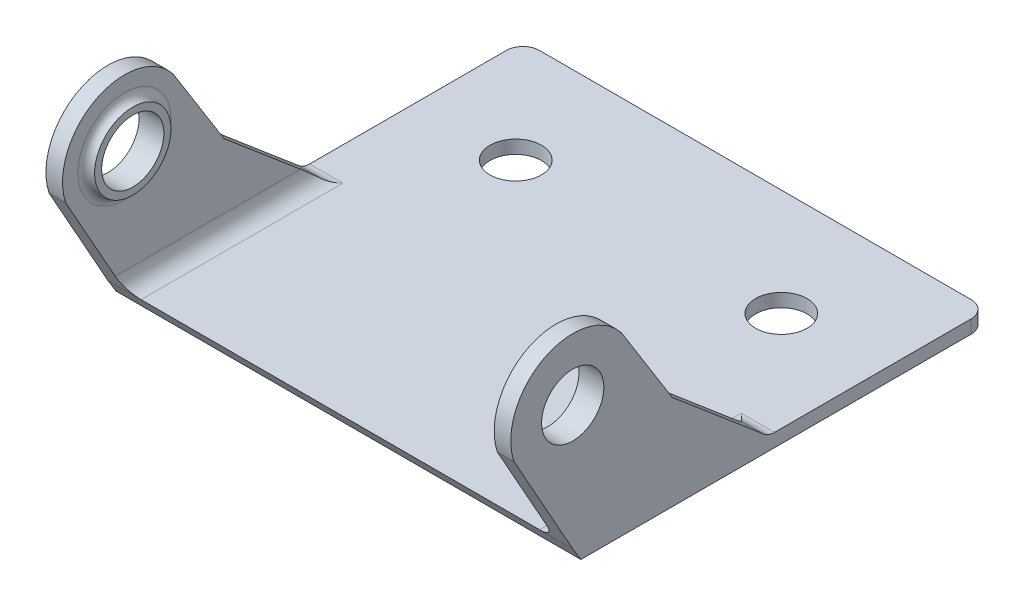
ISO-10303-21;
HEADER;
FILE_DESCRIPTION(('STEP AP214'),'2;1');
FILE_NAME('part.step','',(''),(''),'','','');
FILE_SCHEMA(('AUTOMOTIVE_DESIGN { 1 0 10303 214 1 1 1 1 }'));
ENDSEC;
DATA;
#1=APPLICATION_CONTEXT('core data for automotive mechanical design processes');
#2=APPLICATION_PROTOCOL_DEFINITION('international standard','automotive_design',2000,#1);
#3=PRODUCT_CONTEXT('',#1,'mechanical');
#4=PRODUCT('Part','Part','',(#3));
#5=PRODUCT_RELATED_PRODUCT_CATEGORY('part','',(#4));
#6=PRODUCT_DEFINITION_FORMATION('','',#4);
#7=PRODUCT_DEFINITION_CONTEXT('part definition',#1,'design');
#8=PRODUCT_DEFINITION('design','',#6,#7);
#9=PRODUCT_DEFINITION_SHAPE('','',#8);
#10=(LENGTH_UNIT() NAMED_UNIT(*) SI_UNIT(.MILLI.,.METRE.));
#11=(NAMED_UNIT(*) PLANE_ANGLE_UNIT() SI_UNIT($,.RADIAN.));
#12=(NAMED_UNIT(*) SI_UNIT($,.STERADIAN.) SOLID_ANGLE_UNIT());
#13=UNCERTAINTY_MEASURE_WITH_UNIT(LENGTH_MEASURE(1.E-05),#10,'distance_accuracy_value','');
#14=(GEOMETRIC_REPRESENTATION_CONTEXT(3) GLOBAL_UNCERTAINTY_ASSIGNED_CONTEXT((#13)) GLOBAL_UNIT_ASSIGNED_CONTEXT((#10,
#11,#12)) REPRESENTATION_CONTEXT('',''));
#15=CARTESIAN_POINT('',(0.,0.,0.));
#16=DIRECTION('',(0.,0.,1.));
#17=DIRECTION('',(1.,0.,0.));
#18=AXIS2_PLACEMENT_3D('',#15,#16,#17);
#19=CARTESIAN_POINT('',(31.7500000000001,21.082,47.155100000013));
#20=DIRECTION('',(1.,0.,0.));
#21=DIRECTION('',(0.,0.,-1.));
#22=AXIS2_PLACEMENT_3D('',#19,#20,#21);
#23=TOROIDAL_SURFACE('',#22,7.112,1.27);
#24=CARTESIAN_POINT('',(33.0200000000001,21.082,47.155100000013));
#25=DIRECTION('',(1.,0.,0.));
#26=DIRECTION('',(0.,0.,-1.));
#27=AXIS2_PLACEMENT_3D('',#24,#25,#26);
#28=CIRCLE('',#27,7.112);
#29=CARTESIAN_POINT('',(33.0200000000001,21.082,40.043100000013));
#30=VERTEX_POINT('',#29);
#31=EDGE_CURVE('E11',#30,#30,#28,.T.);
#32=ORIENTED_EDGE('',*,*,#31,.F.);
#33=EDGE_LOOP('',(#32));
#34=FACE_BOUND('',#33,.T.);
#35=CARTESIAN_POINT('',(31.7500000000001,21.082,47.155100000013));
#36=DIRECTION('',(-1.,0.,0.));
#37=DIRECTION('',(0.,0.,1.));
#38=AXIS2_PLACEMENT_3D('',#35,#36,#37);
#39=CIRCLE('',#38,5.842);
#40=CARTESIAN_POINT('',(31.7500000000001,21.082,52.997100000013));
#41=VERTEX_POINT('',#40);
#42=EDGE_CURVE('E303',#41,#41,#39,.T.);
#43=ORIENTED_EDGE('',*,*,#42,.F.);
#44=EDGE_LOOP('',(#43));
#45=FACE_BOUND('',#44,.T.);
#46=ADVANCED_FACE('F47',(#34,#45),#23,.F.);
#47=CARTESIAN_POINT('',(33.0200000000001,0.,0.));
#48=DIRECTION('',(1.,0.,0.));
#49=DIRECTION('',(0.,0.,-1.));
#50=AXIS2_PLACEMENT_3D('',#47,#48,#49);
#51=PLANE('',#50);
#52=ORIENTED_EDGE('',*,*,#31,.T.);
#53=EDGE_LOOP('',(#52));
#54=FACE_BOUND('',#53,.T.);
#55=DIRECTION('',(0.,0.646256714414284,0.763120081687315));
#56=VECTOR('',#55,1.);
#57=CARTESIAN_POINT('',(33.0200000000001,-7.30742805350041,6.18837658449795));
#58=LINE('',#57,#56);
#59=CARTESIAN_POINT('',(33.0200000000001,4.572,20.2159756861986));
#60=VERTEX_POINT('',#59);
#61=CARTESIAN_POINT('',(33.0200000000001,14.4926375068564,31.9305738261713));
#62=VERTEX_POINT('',#61);
#63=EDGE_CURVE('E221',#60,#62,#58,.T.);
#64=ORIENTED_EDGE('',*,*,#63,.F.);
#65=DIRECTION('',(0.,0.,1.));
#66=VECTOR('',#65,1.);
#67=CARTESIAN_POINT('',(33.0200000000001,4.572,0.));
#68=LINE('',#67,#66);
#69=CARTESIAN_POINT('',(33.0200000000001,4.572,48.5771478370212));
#70=VERTEX_POINT('',#69);
#71=EDGE_CURVE('E243',#60,#70,#68,.T.);
#72=ORIENTED_EDGE('',*,*,#71,.T.);
#73=DIRECTION('',(0.,0.872557584871578,0.488511270169972));
#74=VECTOR('',#73,1.);
#75=CARTESIAN_POINT('',(33.0200000000001,-19.6151369839456,35.0357045962964));
#76=LINE('',#75,#74);
#77=CARTESIAN_POINT('',(33.0200000000001,18.1012641162531,56.1516599523088));
#78=VERTEX_POINT('',#77);
#79=EDGE_CURVE('E360',#70,#78,#76,.T.);
#80=ORIENTED_EDGE('',*,*,#79,.T.);
#81=CARTESIAN_POINT('',(33.0200000000001,21.082,47.155100000013));
#82=DIRECTION('',(1.,0.,0.));
#83=DIRECTION('',(0.,0.,-1.));
#84=AXIS2_PLACEMENT_3D('',#81,#82,#83);
#85=CIRCLE('',#84,9.47749320146993);
#86=CARTESIAN_POINT('',(33.0200000000001,26.9532750137127,39.71527425627));
#87=VERTEX_POINT('',#86);
#88=EDGE_CURVE('E357',#87,#78,#85,.T.);
#89=ORIENTED_EDGE('',*,*,#88,.F.);
#90=DIRECTION('',(0.,0.848096115683088,0.529842409177728));
#91=VECTOR('',#90,1.);
#92=CARTESIAN_POINT('',(33.0200000000001,-10.2796748009247,16.4542364260335));
#93=LINE('',#92,#91);
#94=EDGE_CURVE('E354',#62,#87,#93,.T.);
#95=ORIENTED_EDGE('',*,*,#94,.F.);
#96=EDGE_LOOP('',(#64,#72,#80,#89,#95));
#97=FACE_BOUND('',#96,.T.);
#98=ADVANCED_FACE('F450',(#54,#97),#51,.F.);
#99=CARTESIAN_POINT('',(-31.7499999999999,21.082,47.155100000013));
#100=DIRECTION('',(1.,0.,0.));
#101=DIRECTION('',(0.,0.,-1.));
#102=AXIS2_PLACEMENT_3D('',#99,#100,#101);
#103=TOROIDAL_SURFACE('',#102,7.112,1.27);
#104=CARTESIAN_POINT('',(-33.0199999999999,21.082,47.155100000013));
#105=DIRECTION('',(1.,0.,0.));
#106=DIRECTION('',(0.,0.,-1.));
#107=AXIS2_PLACEMENT_3D('',#104,#105,#106);
#108=CIRCLE('',#107,7.112);
#109=CARTESIAN_POINT('',(-33.0199999999999,21.082,40.043100000013));
#110=VERTEX_POINT('',#109);
#111=EDGE_CURVE('E55',#110,#110,#108,.F.);
#112=ORIENTED_EDGE('',*,*,#111,.F.);
#113=EDGE_LOOP('',(#112));
#114=FACE_BOUND('',#113,.T.);
#115=CARTESIAN_POINT('',(-31.7499999999999,21.082,47.155100000013));
#116=DIRECTION('',(1.,0.,0.));
#117=DIRECTION('',(0.,0.,-1.));
#118=AXIS2_PLACEMENT_3D('',#115,#116,#117);
#119=CIRCLE('',#118,5.842);
#120=CARTESIAN_POINT('',(-31.7499999999999,21.082,41.313100000013));
#121=VERTEX_POINT('',#120);
#122=EDGE_CURVE('E268',#121,#121,#119,.T.);
#123=ORIENTED_EDGE('',*,*,#122,.F.);
#124=EDGE_LOOP('',(#123));
#125=FACE_BOUND('',#124,.T.);
#126=ADVANCED_FACE('F456',(#114,#125),#103,.F.);
#127=CARTESIAN_POINT('',(-33.0199999999999,0.,0.));
#128=DIRECTION('',(1.,0.,0.));
#129=DIRECTION('',(0.,0.,-1.));
#130=AXIS2_PLACEMENT_3D('',#127,#128,#129);
#131=PLANE('',#130);
#132=ORIENTED_EDGE('',*,*,#111,.T.);
#133=EDGE_LOOP('',(#132));
#134=FACE_BOUND('',#133,.T.);
#135=DIRECTION('',(0.,0.872557584871578,0.488511270169972));
#136=VECTOR('',#135,1.);
#137=CARTESIAN_POINT('',(-33.0199999999999,-19.6151369839456,35.0357045962964));
#138=LINE('',#137,#136);
#139=CARTESIAN_POINT('',(-33.0199999999999,4.572,48.5771478370212));
#140=VERTEX_POINT('',#139);
#141=CARTESIAN_POINT('',(-33.0199999999999,18.1012641162531,56.1516599523088));
#142=VERTEX_POINT('',#141);
#143=EDGE_CURVE('E341',#140,#142,#138,.T.);
#144=ORIENTED_EDGE('',*,*,#143,.F.);
#145=DIRECTION('',(0.,0.,1.));
#146=VECTOR('',#145,1.);
#147=CARTESIAN_POINT('',(-33.0199999999999,4.572,17.2166644771189));
#148=LINE('',#147,#146);
#149=CARTESIAN_POINT('',(-33.0199999999999,4.572,20.2159756861986));
#150=VERTEX_POINT('',#149);
#151=EDGE_CURVE('E247',#140,#150,#148,.F.);
#152=ORIENTED_EDGE('',*,*,#151,.T.);
#153=DIRECTION('',(0.,0.646256714414284,0.763120081687315));
#154=VECTOR('',#153,1.);
#155=CARTESIAN_POINT('',(-33.0199999999999,-7.30742805350041,6.18837658449795));
#156=LINE('',#155,#154);
#157=CARTESIAN_POINT('',(-33.0199999999999,14.4926375068564,31.9305738261713));
#158=VERTEX_POINT('',#157);
#159=EDGE_CURVE('E325',#150,#158,#156,.T.);
#160=ORIENTED_EDGE('',*,*,#159,.T.);
#161=DIRECTION('',(0.,0.848096115683088,0.529842409177728));
#162=VECTOR('',#161,1.);
#163=CARTESIAN_POINT('',(-33.0199999999999,-10.2796748009247,16.4542364260335));
#164=LINE('',#163,#162);
#165=CARTESIAN_POINT('',(-33.0199999999999,26.9532750137127,39.71527425627));
#166=VERTEX_POINT('',#165);
#167=EDGE_CURVE('E314',#158,#166,#164,.T.);
#168=ORIENTED_EDGE('',*,*,#167,.T.);
#169=CARTESIAN_POINT('',(-33.0199999999999,21.082,47.155100000013));
#170=DIRECTION('',(1.,0.,0.));
#171=DIRECTION('',(0.,0.,-1.));
#172=AXIS2_PLACEMENT_3D('',#169,#170,#171);
#173=CIRCLE('',#172,9.47749320146993);
#174=EDGE_CURVE('E338',#166,#142,#173,.T.);
#175=ORIENTED_EDGE('',*,*,#174,.T.);
#176=EDGE_LOOP('',(#144,#152,#160,#168,#175));
#177=FACE_BOUND('',#176,.T.);
#178=ADVANCED_FACE('F405',(#134,#177),#131,.T.);
#179=CARTESIAN_POINT('',(33.0200000000001,2.032,-13.804899999987));
#180=DIRECTION('',(0.,-1.,0.));
#181=DIRECTION('',(0.,0.,-1.));
#182=AXIS2_PLACEMENT_3D('',#179,#180,#181);
#183=CYLINDRICAL_SURFACE('',#182,2.54);
#184=DIRECTION('',(0.,-1.,0.));
#185=VECTOR('',#184,1.);
#186=CARTESIAN_POINT('',(33.0200000000001,2.032,-16.344899999987));
#187=LINE('',#186,#185);
#188=CARTESIAN_POINT('',(33.0200000000001,2.032,-16.344899999987));
#189=VERTEX_POINT('',#188);
#190=CARTESIAN_POINT('',(33.0200000000001,0.,-16.344899999987));
#191=VERTEX_POINT('',#190);
#192=EDGE_CURVE('E278',#189,#191,#187,.T.);
#193=ORIENTED_EDGE('',*,*,#192,.F.);
#194=CARTESIAN_POINT('',(33.0200000000001,2.032,-13.804899999987));
#195=DIRECTION('',(0.,1.,0.));
#196=DIRECTION('',(0.,0.,1.));
#197=AXIS2_PLACEMENT_3D('',#194,#195,#196);
#198=CIRCLE('',#197,2.54);
#199=CARTESIAN_POINT('',(35.5600000000001,2.032,-13.804899999987));
#200=VERTEX_POINT('',#199);
#201=EDGE_CURVE('E63',#200,#189,#198,.T.);
#202=ORIENTED_EDGE('',*,*,#201,.F.);
#203=DIRECTION('',(0.,-1.,0.));
#204=VECTOR('',#203,1.);
#205=CARTESIAN_POINT('',(35.5600000000001,0.,-13.804899999987));
#206=LINE('',#205,#204);
#207=CARTESIAN_POINT('',(35.5600000000001,0.,-13.804899999987));
#208=VERTEX_POINT('',#207);
#209=EDGE_CURVE('E281',#208,#200,#206,.F.);
#210=ORIENTED_EDGE('',*,*,#209,.F.);
#211=CARTESIAN_POINT('',(33.0200000000001,0.,-13.804899999987));
#212=DIRECTION('',(0.,1.,0.));
#213=DIRECTION('',(0.,0.,1.));
#214=AXIS2_PLACEMENT_3D('',#211,#212,#213);
#215=CIRCLE('',#214,2.54);
#216=EDGE_CURVE('E71',#191,#208,#215,.F.);
#217=ORIENTED_EDGE('',*,*,#216,.F.);
#218=EDGE_LOOP('',(#193,#202,#210,#217));
#219=FACE_BOUND('',#218,.T.);
#220=ADVANCED_FACE('F417',(#219),#183,.T.);
#221=CARTESIAN_POINT('',(-33.0199999999999,2.032,-13.804899999987));
#222=DIRECTION('',(0.,-1.,0.));
#223=DIRECTION('',(0.,0.,-1.));
#224=AXIS2_PLACEMENT_3D('',#221,#222,#223);
#225=CYLINDRICAL_SURFACE('',#224,2.54);
#226=DIRECTION('',(0.,1.,0.));
#227=VECTOR('',#226,1.);
#228=CARTESIAN_POINT('',(-33.0199999999999,2.032,-16.344899999987));
#229=LINE('',#228,#227);
#230=CARTESIAN_POINT('',(-33.0199999999999,0.,-16.344899999987));
#231=VERTEX_POINT('',#230);
#232=CARTESIAN_POINT('',(-33.0199999999999,2.032,-16.344899999987));
#233=VERTEX_POINT('',#232);
#234=EDGE_CURVE('E261',#231,#233,#229,.T.);
#235=ORIENTED_EDGE('',*,*,#234,.F.);
#236=CARTESIAN_POINT('',(-33.0199999999999,0.,-13.804899999987));
#237=DIRECTION('',(0.,1.,0.));
#238=DIRECTION('',(0.,0.,1.));
#239=AXIS2_PLACEMENT_3D('',#236,#237,#238);
#240=CIRCLE('',#239,2.54);
#241=CARTESIAN_POINT('',(-35.5599999999999,0.,-13.804899999987));
#242=VERTEX_POINT('',#241);
#243=EDGE_CURVE('E274',#242,#231,#240,.F.);
#244=ORIENTED_EDGE('',*,*,#243,.F.);
#245=DIRECTION('',(0.,1.,0.));
#246=VECTOR('',#245,1.);
#247=CARTESIAN_POINT('',(-35.5599999999999,2.032,-13.804899999987));
#248=LINE('',#247,#246);
#249=CARTESIAN_POINT('',(-35.5599999999999,2.032,-13.804899999987));
#250=VERTEX_POINT('',#249);
#251=EDGE_CURVE('E271',#250,#242,#248,.F.);
#252=ORIENTED_EDGE('',*,*,#251,.F.);
#253=CARTESIAN_POINT('',(-33.0199999999999,2.032,-13.804899999987));
#254=DIRECTION('',(0.,1.,0.));
#255=DIRECTION('',(0.,0.,1.));
#256=AXIS2_PLACEMENT_3D('',#253,#254,#255);
#257=CIRCLE('',#256,2.54);
#258=EDGE_CURVE('E276',#233,#250,#257,.T.);
#259=ORIENTED_EDGE('',*,*,#258,.F.);
#260=EDGE_LOOP('',(#235,#244,#252,#259));
#261=FACE_BOUND('',#260,.T.);
#262=ADVANCED_FACE('F423',(#261),#225,.T.);
#263=CARTESIAN_POINT('',(0.,2.032,0.));
#264=DIRECTION('',(0.,1.,0.));
#265=DIRECTION('',(0.,0.,1.));
#266=AXIS2_PLACEMENT_3D('',#263,#264,#265);
#267=PLANE('',#266);
#268=CARTESIAN_POINT('',(-20.3199999999999,2.032,1.31006316905768E-11));
#269=DIRECTION('',(0.,1.,0.));
#270=DIRECTION('',(0.,0.,1.));
#271=AXIS2_PLACEMENT_3D('',#268,#269,#270);
#272=CIRCLE('',#271,3.937);
#273=CARTESIAN_POINT('',(-20.3199999999999,2.032,3.9370000000131));
#274=VERTEX_POINT('',#273);
#275=EDGE_CURVE('E288',#274,#274,#272,.T.);
#276=ORIENTED_EDGE('',*,*,#275,.F.);
#277=EDGE_LOOP('',(#276));
#278=FACE_BOUND('',#277,.T.);
#279=CARTESIAN_POINT('',(20.3200000000001,2.032,-1.28785870856518E-11));
#280=DIRECTION('',(0.,1.,0.));
#281=DIRECTION('',(0.,0.,1.));
#282=AXIS2_PLACEMENT_3D('',#279,#280,#281);
#283=CIRCLE('',#282,3.937);
#284=CARTESIAN_POINT('',(20.3200000000001,2.032,3.93699999998712));
#285=VERTEX_POINT('',#284);
#286=EDGE_CURVE('E294',#285,#285,#283,.T.);
#287=ORIENTED_EDGE('',*,*,#286,.F.);
#288=EDGE_LOOP('',(#287));
#289=FACE_BOUND('',#288,.T.);
#290=DIRECTION('',(0.,0.,1.));
#291=VECTOR('',#290,1.);
#292=CARTESIAN_POINT('',(35.5600000000001,2.032,-16.344899999987));
#293=LINE('',#292,#291);
#294=CARTESIAN_POINT('',(35.5600000000001,2.032,16.2856490167077));
#295=VERTEX_POINT('',#294);
#296=EDGE_CURVE('E318',#200,#295,#293,.T.);
#297=ORIENTED_EDGE('',*,*,#296,.F.);
#298=ORIENTED_EDGE('',*,*,#201,.T.);
#299=DIRECTION('',(1.,0.,0.));
#300=VECTOR('',#299,1.);
#301=CARTESIAN_POINT('',(0.,2.032,-16.344899999987));
#302=LINE('',#301,#300);
#303=EDGE_CURVE('E224',#233,#189,#302,.T.);
#304=ORIENTED_EDGE('',*,*,#303,.F.);
#305=ORIENTED_EDGE('',*,*,#258,.T.);
#306=DIRECTION('',(0.,0.,-1.));
#307=VECTOR('',#306,1.);
#308=CARTESIAN_POINT('',(-35.5599999999999,2.032,-16.344899999987));
#309=LINE('',#308,#307);
#310=CARTESIAN_POINT('',(-35.5599999999999,2.032,16.2856490167077));
#311=VERTEX_POINT('',#310);
#312=EDGE_CURVE('E315',#311,#250,#309,.T.);
#313=ORIENTED_EDGE('',*,*,#312,.F.);
#314=DIRECTION('',(1.,0.,0.));
#315=VECTOR('',#314,1.);
#316=CARTESIAN_POINT('',(-33.0199999999999,2.032,16.2856490167077));
#317=LINE('',#316,#315);
#318=CARTESIAN_POINT('',(-30.4799999999999,2.032,16.2856490167077));
#319=VERTEX_POINT('',#318);
#320=EDGE_CURVE('E233',#311,#319,#317,.T.);
#321=ORIENTED_EDGE('',*,*,#320,.T.);
#322=DIRECTION('',(0.,0.,1.));
#323=VECTOR('',#322,1.);
#324=CARTESIAN_POINT('',(-30.4799999999999,2.032,47.155100000013));
#325=LINE('',#324,#323);
#326=CARTESIAN_POINT('',(-30.4799999999999,2.032,47.155100000013));
#327=VERTEX_POINT('',#326);
#328=EDGE_CURVE('E230',#319,#327,#325,.T.);
#329=ORIENTED_EDGE('',*,*,#328,.T.);
#330=DIRECTION('',(1.,0.,0.));
#331=VECTOR('',#330,1.);
#332=CARTESIAN_POINT('',(0.,2.032,47.155100000013));
#333=LINE('',#332,#331);
#334=CARTESIAN_POINT('',(30.4800000000001,2.032,47.155100000013));
#335=VERTEX_POINT('',#334);
#336=EDGE_CURVE('E192',#327,#335,#333,.T.);
#337=ORIENTED_EDGE('',*,*,#336,.T.);
#338=DIRECTION('',(0.,0.,1.));
#339=VECTOR('',#338,1.);
#340=CARTESIAN_POINT('',(30.4800000000001,2.032,0.));
#341=LINE('',#340,#339);
#342=CARTESIAN_POINT('',(30.4800000000001,2.032,16.2856490167077));
#343=VERTEX_POINT('',#342);
#344=EDGE_CURVE('E236',#335,#343,#341,.F.);
#345=ORIENTED_EDGE('',*,*,#344,.T.);
#346=DIRECTION('',(1.,0.,0.));
#347=VECTOR('',#346,1.);
#348=CARTESIAN_POINT('',(35.5600000000001,2.032,16.2856490167077));
#349=LINE('',#348,#347);
#350=EDGE_CURVE('E238',#343,#295,#349,.T.);
#351=ORIENTED_EDGE('',*,*,#350,.T.);
#352=EDGE_LOOP('',(#297,#298,#304,#305,#313,#321,#329,#337,#345,#351));
#353=FACE_BOUND('',#352,.T.);
#354=ADVANCED_FACE('F390',(#278,#289,#353),#267,.T.);
#355=CARTESIAN_POINT('',(0.,0.,0.));
#356=DIRECTION('',(0.,1.,0.));
#357=DIRECTION('',(0.,0.,1.));
#358=AXIS2_PLACEMENT_3D('',#355,#356,#357);
#359=PLANE('',#358);
#360=CARTESIAN_POINT('',(-20.3199999999999,0.,1.31006316905768E-11));
#361=DIRECTION('',(0.,1.,0.));
#362=DIRECTION('',(0.,0.,1.));
#363=AXIS2_PLACEMENT_3D('',#360,#361,#362);
#364=CIRCLE('',#363,3.937);
#365=CARTESIAN_POINT('',(-20.3199999999999,0.,3.9370000000131));
#366=VERTEX_POINT('',#365);
#367=EDGE_CURVE('E50',#366,#366,#364,.T.);
#368=ORIENTED_EDGE('',*,*,#367,.T.);
#369=EDGE_LOOP('',(#368));
#370=FACE_BOUND('',#369,.T.);
#371=CARTESIAN_POINT('',(20.3200000000001,0.,-1.28785870856518E-11));
#372=DIRECTION('',(0.,1.,0.));
#373=DIRECTION('',(0.,0.,1.));
#374=AXIS2_PLACEMENT_3D('',#371,#372,#373);
#375=CIRCLE('',#374,3.937);
#376=CARTESIAN_POINT('',(20.3200000000001,0.,3.93699999998712));
#377=VERTEX_POINT('',#376);
#378=EDGE_CURVE('E286',#377,#377,#375,.T.);
#379=ORIENTED_EDGE('',*,*,#378,.T.);
#380=EDGE_LOOP('',(#379));
#381=FACE_BOUND('',#380,.T.);
#382=DIRECTION('',(1.,0.,0.));
#383=VECTOR('',#382,1.);
#384=CARTESIAN_POINT('',(0.,0.,-16.344899999987));
#385=LINE('',#384,#383);
#386=EDGE_CURVE('E223',#231,#191,#385,.T.);
#387=ORIENTED_EDGE('',*,*,#386,.T.);
#388=ORIENTED_EDGE('',*,*,#216,.T.);
#389=DIRECTION('',(0.,0.,1.));
#390=VECTOR('',#389,1.);
#391=CARTESIAN_POINT('',(35.5600000000001,0.,-16.344899999987));
#392=LINE('',#391,#390);
#393=CARTESIAN_POINT('',(35.5600000000001,0.,45.9095872622421));
#394=VERTEX_POINT('',#393);
#395=EDGE_CURVE('E265',#208,#394,#392,.T.);
#396=ORIENTED_EDGE('',*,*,#395,.T.);
#397=DIRECTION('',(1.,0.,0.));
#398=VECTOR('',#397,1.);
#399=CARTESIAN_POINT('',(-38.0999999999999,0.,45.9095872622421));
#400=LINE('',#399,#398);
#401=CARTESIAN_POINT('',(-35.5599999999999,0.,45.9095872622421));
#402=VERTEX_POINT('',#401);
#403=EDGE_CURVE('E188',#402,#394,#400,.T.);
#404=ORIENTED_EDGE('',*,*,#403,.F.);
#405=DIRECTION('',(0.,0.,-1.));
#406=VECTOR('',#405,1.);
#407=CARTESIAN_POINT('',(-35.5599999999999,0.,-16.344899999987));
#408=LINE('',#407,#406);
#409=EDGE_CURVE('E311',#402,#242,#408,.T.);
#410=ORIENTED_EDGE('',*,*,#409,.T.);
#411=ORIENTED_EDGE('',*,*,#243,.T.);
#412=EDGE_LOOP('',(#387,#388,#396,#404,#410,#411));
#413=FACE_BOUND('',#412,.T.);
#414=ADVANCED_FACE('F415',(#370,#381,#413),#359,.F.);
#415=CARTESIAN_POINT('',(0.,2.032,-16.344899999987));
#416=DIRECTION('',(0.,0.,-1.));
#417=DIRECTION('',(-1.,0.,0.));
#418=AXIS2_PLACEMENT_3D('',#415,#416,#417);
#419=PLANE('',#418);
#420=ORIENTED_EDGE('',*,*,#303,.T.);
#421=ORIENTED_EDGE('',*,*,#192,.T.);
#422=ORIENTED_EDGE('',*,*,#386,.F.);
#423=ORIENTED_EDGE('',*,*,#234,.T.);
#424=EDGE_LOOP('',(#420,#421,#422,#423));
#425=FACE_BOUND('',#424,.T.);
#426=ADVANCED_FACE('F420',(#425),#419,.T.);
#427=CARTESIAN_POINT('',(-38.0999999999999,2.032,47.155100000013));
#428=DIRECTION('',(0.,-0.522590539790339,0.852583795131975));
#429=DIRECTION('',(0.,-0.852583795131975,-0.522590539790339));
#430=AXIS2_PLACEMENT_3D('',#427,#428,#429);
#431=PLANE('',#430);
#432=DIRECTION('',(0.,0.852583795131975,0.522590539790339));
#433=VECTOR('',#432,1.);
#434=CARTESIAN_POINT('',(-35.5599999999999,2.032,47.155100000013));
#435=LINE('',#434,#433);
#436=CARTESIAN_POINT('',(-35.5599999999999,2.032,47.155100000013));
#437=VERTEX_POINT('',#436);
#438=EDGE_CURVE('E191',#402,#437,#435,.T.);
#439=ORIENTED_EDGE('',*,*,#438,.F.);
#440=ORIENTED_EDGE('',*,*,#403,.T.);
#441=DIRECTION('',(0.,-0.852583795131975,-0.522590539790339));
#442=VECTOR('',#441,1.);
#443=CARTESIAN_POINT('',(35.5600000000001,2.032,47.155100000013));
#444=LINE('',#443,#442);
#445=CARTESIAN_POINT('',(35.5600000000001,2.032,47.155100000013));
#446=VERTEX_POINT('',#445);
#447=EDGE_CURVE('E179',#446,#394,#444,.T.);
#448=ORIENTED_EDGE('',*,*,#447,.F.);
#449=DIRECTION('',(1.,0.,0.));
#450=VECTOR('',#449,1.);
#451=CARTESIAN_POINT('',(33.0200000000001,2.032,47.155100000013));
#452=LINE('',#451,#450);
#453=EDGE_CURVE('E185',#335,#446,#452,.T.);
#454=ORIENTED_EDGE('',*,*,#453,.F.);
#455=ORIENTED_EDGE('',*,*,#336,.F.);
#456=DIRECTION('',(1.,0.,0.));
#457=VECTOR('',#456,1.);
#458=CARTESIAN_POINT('',(-35.5599999999999,2.032,47.155100000013));
#459=LINE('',#458,#457);
#460=EDGE_CURVE('E348',#437,#327,#459,.T.);
#461=ORIENTED_EDGE('',*,*,#460,.F.);
#462=EDGE_LOOP('',(#439,#440,#448,#454,#455,#461));
#463=FACE_BOUND('',#462,.T.);
#464=ADVANCED_FACE('F182',(#463),#431,.T.);
#465=CARTESIAN_POINT('',(33.0200000000001,-10.2796748009247,16.4542364260335));
#466=DIRECTION('',(0.,0.529842409177728,-0.848096115683088));
#467=DIRECTION('',(0.,0.848096115683088,0.529842409177728));
#468=AXIS2_PLACEMENT_3D('',#465,#466,#467);
#469=PLANE('',#468);
#470=DIRECTION('',(0.,0.848096115683088,0.529842409177728));
#471=VECTOR('',#470,1.);
#472=CARTESIAN_POINT('',(35.5600000000001,-10.2796748009247,16.4542364260335));
#473=LINE('',#472,#471);
#474=CARTESIAN_POINT('',(35.5600000000001,14.4926375068564,31.9305738261713));
#475=VERTEX_POINT('',#474);
#476=CARTESIAN_POINT('',(35.5600000000001,26.9532750137127,39.71527425627));
#477=VERTEX_POINT('',#476);
#478=EDGE_CURVE('E365',#475,#477,#473,.T.);
#479=ORIENTED_EDGE('',*,*,#478,.F.);
#480=DIRECTION('',(1.,0.,0.));
#481=VECTOR('',#480,1.);
#482=CARTESIAN_POINT('',(33.0200000000001,14.4926375068564,31.9305738261713));
#483=LINE('',#482,#481);
#484=EDGE_CURVE('E211',#62,#475,#483,.T.);
#485=ORIENTED_EDGE('',*,*,#484,.F.);
#486=ORIENTED_EDGE('',*,*,#94,.T.);
#487=DIRECTION('',(1.,0.,0.));
#488=VECTOR('',#487,1.);
#489=CARTESIAN_POINT('',(33.0200000000001,26.9532750137127,39.71527425627));
#490=LINE('',#489,#488);
#491=EDGE_CURVE('E216',#87,#477,#490,.T.);
#492=ORIENTED_EDGE('',*,*,#491,.T.);
#493=EDGE_LOOP('',(#479,#485,#486,#492));
#494=FACE_BOUND('',#493,.T.);
#495=ADVANCED_FACE('F377',(#494),#469,.T.);
#496=CARTESIAN_POINT('',(33.0200000000001,-7.30742805350041,6.18837658449795));
#497=DIRECTION('',(0.,0.763120081687315,-0.646256714414284));
#498=DIRECTION('',(0.,0.646256714414284,0.763120081687315));
#499=AXIS2_PLACEMENT_3D('',#496,#497,#498);
#500=PLANE('',#499);
#501=DIRECTION('',(0.,0.646256714414284,0.763120081687315));
#502=VECTOR('',#501,1.);
#503=CARTESIAN_POINT('',(35.5600000000001,-7.30742805350041,6.18837658449795));
#504=LINE('',#503,#502);
#505=CARTESIAN_POINT('',(35.5600000000001,2.63367499251422,17.92714107132));
#506=VERTEX_POINT('',#505);
#507=EDGE_CURVE('E203',#506,#475,#504,.T.);
#508=ORIENTED_EDGE('',*,*,#507,.F.);
#509=DIRECTION('',(1.,0.,0.));
#510=VECTOR('',#509,1.);
#511=CARTESIAN_POINT('',(33.0200000000001,2.63367499251422,17.92714107132));
#512=LINE('',#511,#510);
#513=CARTESIAN_POINT('',(32.1214920546124,2.63367499251422,17.92714107132));
#514=VERTEX_POINT('',#513);
#515=EDGE_CURVE('E241',#506,#514,#512,.F.);
#516=ORIENTED_EDGE('',*,*,#515,.T.);
#517=CARTESIAN_POINT('',(30.4800000000001,4.572,20.2159756861986));
#518=DIRECTION('',(0.,0.763120081687315,-0.646256714414284));
#519=DIRECTION('',(0.,0.646256714414284,0.763120081687315));
#520=AXIS2_PLACEMENT_3D('',#517,#518,#519);
#521=ELLIPSE('',#520,3.93032666949086,2.54);
#522=EDGE_CURVE('E252',#514,#60,#521,.F.);
#523=ORIENTED_EDGE('',*,*,#522,.T.);
#524=ORIENTED_EDGE('',*,*,#63,.T.);
#525=ORIENTED_EDGE('',*,*,#484,.T.);
#526=EDGE_LOOP('',(#508,#516,#523,#524,#525));
#527=FACE_BOUND('',#526,.T.);
#528=ADVANCED_FACE('F373',(#527),#500,.T.);
#529=CARTESIAN_POINT('',(33.0200000000001,-19.6151369839456,35.0357045962964));
#530=DIRECTION('',(0.,0.488511270169973,-0.872557584871578));
#531=DIRECTION('',(0.,0.872557584871577,0.488511270169972));
#532=AXIS2_PLACEMENT_3D('',#529,#530,#531);
#533=PLANE('',#532);
#534=DIRECTION('',(0.,0.872557584871578,0.488511270169972));
#535=VECTOR('',#534,1.);
#536=CARTESIAN_POINT('',(35.5600000000001,-19.6151369839456,35.0357045962964));
#537=LINE('',#536,#535);
#538=CARTESIAN_POINT('',(35.5600000000001,18.1012641162531,56.1516599523088));
#539=VERTEX_POINT('',#538);
#540=EDGE_CURVE('E196',#446,#539,#537,.T.);
#541=ORIENTED_EDGE('',*,*,#540,.T.);
#542=DIRECTION('',(1.,0.,0.));
#543=VECTOR('',#542,1.);
#544=CARTESIAN_POINT('',(33.0200000000001,18.1012641162531,56.1516599523088));
#545=LINE('',#544,#543);
#546=EDGE_CURVE('E212',#78,#539,#545,.T.);
#547=ORIENTED_EDGE('',*,*,#546,.F.);
#548=ORIENTED_EDGE('',*,*,#79,.F.);
#549=CARTESIAN_POINT('',(30.4800000000001,4.572,48.5771478370212));
#550=DIRECTION('',(0.,0.488511270169973,-0.872557584871578));
#551=DIRECTION('',(0.,0.872557584871577,0.488511270169972));
#552=AXIS2_PLACEMENT_3D('',#549,#550,#551);
#553=ELLIPSE('',#552,2.91098266067315,2.54);
#554=EDGE_CURVE('E209',#70,#335,#553,.T.);
#555=ORIENTED_EDGE('',*,*,#554,.T.);
#556=ORIENTED_EDGE('',*,*,#453,.T.);
#557=EDGE_LOOP('',(#541,#547,#548,#555,#556));
#558=FACE_BOUND('',#557,.T.);
#559=ADVANCED_FACE('F206',(#558),#533,.F.);
#560=CARTESIAN_POINT('',(33.0200000000001,21.082,47.155100000013));
#561=DIRECTION('',(1.,0.,0.));
#562=DIRECTION('',(0.,0.,-1.));
#563=AXIS2_PLACEMENT_3D('',#560,#561,#562);
#564=CYLINDRICAL_SURFACE('',#563,4.7625);
#565=CARTESIAN_POINT('',(35.5600000000001,21.082,47.155100000013));
#566=DIRECTION('',(1.,0.,0.));
#567=DIRECTION('',(0.,0.,-1.));
#568=AXIS2_PLACEMENT_3D('',#565,#566,#567);
#569=CIRCLE('',#568,4.7625);
#570=CARTESIAN_POINT('',(35.5600000000001,21.082,42.392600000013));
#571=VERTEX_POINT('',#570);
#572=EDGE_CURVE('E347',#571,#571,#569,.T.);
#573=ORIENTED_EDGE('',*,*,#572,.T.);
#574=EDGE_LOOP('',(#573));
#575=FACE_BOUND('',#574,.T.);
#576=CARTESIAN_POINT('',(31.7500000000001,21.082,47.155100000013));
#577=DIRECTION('',(-1.,0.,0.));
#578=DIRECTION('',(0.,0.,1.));
#579=AXIS2_PLACEMENT_3D('',#576,#577,#578);
#580=CIRCLE('',#579,4.7625);
#581=CARTESIAN_POINT('',(31.7500000000001,21.082,51.917600000013));
#582=VERTEX_POINT('',#581);
#583=EDGE_CURVE('E292',#582,#582,#580,.T.);
#584=ORIENTED_EDGE('',*,*,#583,.T.);
#585=EDGE_LOOP('',(#584));
#586=FACE_BOUND('',#585,.T.);
#587=ADVANCED_FACE('F470',(#575,#586),#564,.F.);
#588=CARTESIAN_POINT('',(33.0200000000001,21.082,47.155100000013));
#589=DIRECTION('',(1.,0.,0.));
#590=DIRECTION('',(0.,0.,-1.));
#591=AXIS2_PLACEMENT_3D('',#588,#589,#590);
#592=CYLINDRICAL_SURFACE('',#591,9.47749320146993);
#593=CARTESIAN_POINT('',(35.5600000000001,21.082,47.155100000013));
#594=DIRECTION('',(1.,0.,0.));
#595=DIRECTION('',(0.,0.,-1.));
#596=AXIS2_PLACEMENT_3D('',#593,#594,#595);
#597=CIRCLE('',#596,9.47749320146993);
#598=EDGE_CURVE('E200',#477,#539,#597,.T.);
#599=ORIENTED_EDGE('',*,*,#598,.F.);
#600=ORIENTED_EDGE('',*,*,#491,.F.);
#601=ORIENTED_EDGE('',*,*,#88,.T.);
#602=ORIENTED_EDGE('',*,*,#546,.T.);
#603=EDGE_LOOP('',(#599,#600,#601,#602));
#604=FACE_BOUND('',#603,.T.);
#605=ADVANCED_FACE('F380',(#604),#592,.T.);
#606=CARTESIAN_POINT('',(35.5600000000001,0.,0.));
#607=DIRECTION('',(1.,0.,0.));
#608=DIRECTION('',(0.,0.,-1.));
#609=AXIS2_PLACEMENT_3D('',#606,#607,#608);
#610=PLANE('',#609);
#611=ORIENTED_EDGE('',*,*,#572,.F.);
#612=EDGE_LOOP('',(#611));
#613=FACE_BOUND('',#612,.T.);
#614=ORIENTED_EDGE('',*,*,#395,.F.);
#615=ORIENTED_EDGE('',*,*,#209,.T.);
#616=ORIENTED_EDGE('',*,*,#296,.T.);
#617=CARTESIAN_POINT('',(35.5600000000001,4.572,16.2856490167077));
#618=DIRECTION('',(1.,0.,0.));
#619=DIRECTION('',(0.,0.,-1.));
#620=AXIS2_PLACEMENT_3D('',#617,#618,#619);
#621=CIRCLE('',#620,2.54);
#622=EDGE_CURVE('E249',#295,#506,#621,.F.);
#623=ORIENTED_EDGE('',*,*,#622,.T.);
#624=ORIENTED_EDGE('',*,*,#507,.T.);
#625=ORIENTED_EDGE('',*,*,#478,.T.);
#626=ORIENTED_EDGE('',*,*,#598,.T.);
#627=ORIENTED_EDGE('',*,*,#540,.F.);
#628=ORIENTED_EDGE('',*,*,#447,.T.);
#629=EDGE_LOOP('',(#614,#615,#616,#623,#624,#625,#626,#627,#628));
#630=FACE_BOUND('',#629,.T.);
#631=ADVANCED_FACE('F197',(#613,#630),#610,.T.);
#632=CARTESIAN_POINT('',(-35.5599999999999,-10.2796748009247,16.4542364260335));
#633=DIRECTION('',(0.,0.529842409177728,-0.848096115683088));
#634=DIRECTION('',(0.,0.848096115683088,0.529842409177728));
#635=AXIS2_PLACEMENT_3D('',#632,#633,#634);
#636=PLANE('',#635);
#637=ORIENTED_EDGE('',*,*,#167,.F.);
#638=DIRECTION('',(1.,0.,0.));
#639=VECTOR('',#638,1.);
#640=CARTESIAN_POINT('',(-35.5599999999999,14.4926375068564,31.9305738261713));
#641=LINE('',#640,#639);
#642=CARTESIAN_POINT('',(-35.5599999999999,14.4926375068564,31.9305738261713));
#643=VERTEX_POINT('',#642);
#644=EDGE_CURVE('E344',#643,#158,#641,.T.);
#645=ORIENTED_EDGE('',*,*,#644,.F.);
#646=DIRECTION('',(0.,0.848096115683088,0.529842409177728));
#647=VECTOR('',#646,1.);
#648=CARTESIAN_POINT('',(-35.5599999999999,-10.2796748009247,16.4542364260335));
#649=LINE('',#648,#647);
#650=CARTESIAN_POINT('',(-35.5599999999999,26.9532750137127,39.71527425627));
#651=VERTEX_POINT('',#650);
#652=EDGE_CURVE('E324',#643,#651,#649,.T.);
#653=ORIENTED_EDGE('',*,*,#652,.T.);
#654=DIRECTION('',(1.,0.,0.));
#655=VECTOR('',#654,1.);
#656=CARTESIAN_POINT('',(-35.5599999999999,26.9532750137127,39.71527425627));
#657=LINE('',#656,#655);
#658=EDGE_CURVE('E335',#651,#166,#657,.T.);
#659=ORIENTED_EDGE('',*,*,#658,.T.);
#660=EDGE_LOOP('',(#637,#645,#653,#659));
#661=FACE_BOUND('',#660,.T.);
#662=ADVANCED_FACE('F435',(#661),#636,.T.);
#663=CARTESIAN_POINT('',(-35.5599999999999,-7.30742805350041,6.18837658449795));
#664=DIRECTION('',(0.,0.763120081687315,-0.646256714414284));
#665=DIRECTION('',(0.,0.646256714414284,0.763120081687315));
#666=AXIS2_PLACEMENT_3D('',#663,#664,#665);
#667=PLANE('',#666);
#668=ORIENTED_EDGE('',*,*,#159,.F.);
#669=CARTESIAN_POINT('',(-30.4799999999999,4.572,20.2159756861986));
#670=DIRECTION('',(0.,0.763120081687315,-0.646256714414284));
#671=DIRECTION('',(0.,-0.646256714414284,-0.763120081687315));
#672=AXIS2_PLACEMENT_3D('',#669,#670,#671);
#673=ELLIPSE('',#672,3.93032666949086,2.54);
#674=CARTESIAN_POINT('',(-32.1214920546122,2.63367499251422,17.92714107132));
#675=VERTEX_POINT('',#674);
#676=EDGE_CURVE('E258',#150,#675,#673,.F.);
#677=ORIENTED_EDGE('',*,*,#676,.T.);
#678=DIRECTION('',(1.,0.,0.));
#679=VECTOR('',#678,1.);
#680=CARTESIAN_POINT('',(-35.5599999999999,2.63367499251422,17.92714107132));
#681=LINE('',#680,#679);
#682=CARTESIAN_POINT('',(-35.5599999999999,2.63367499251422,17.92714107132));
#683=VERTEX_POINT('',#682);
#684=EDGE_CURVE('E245',#675,#683,#681,.F.);
#685=ORIENTED_EDGE('',*,*,#684,.T.);
#686=DIRECTION('',(0.,0.646256714414284,0.763120081687315));
#687=VECTOR('',#686,1.);
#688=CARTESIAN_POINT('',(-35.5599999999999,-7.30742805350041,6.18837658449795));
#689=LINE('',#688,#687);
#690=EDGE_CURVE('E333',#683,#643,#689,.T.);
#691=ORIENTED_EDGE('',*,*,#690,.T.);
#692=ORIENTED_EDGE('',*,*,#644,.T.);
#693=EDGE_LOOP('',(#668,#677,#685,#691,#692));
#694=FACE_BOUND('',#693,.T.);
#695=ADVANCED_FACE('F431',(#694),#667,.T.);
#696=CARTESIAN_POINT('',(-35.5599999999999,-19.6151369839456,35.0357045962964));
#697=DIRECTION('',(0.,0.488511270169973,-0.872557584871578));
#698=DIRECTION('',(0.,0.872557584871577,0.488511270169972));
#699=AXIS2_PLACEMENT_3D('',#696,#697,#698);
#700=PLANE('',#699);
#701=ORIENTED_EDGE('',*,*,#460,.T.);
#702=CARTESIAN_POINT('',(-30.4799999999999,4.572,48.5771478370212));
#703=DIRECTION('',(0.,0.488511270169973,-0.872557584871578));
#704=DIRECTION('',(0.,-0.872557584871577,-0.488511270169972));
#705=AXIS2_PLACEMENT_3D('',#702,#703,#704);
#706=ELLIPSE('',#705,2.91098266067315,2.54);
#707=EDGE_CURVE('E256',#327,#140,#706,.T.);
#708=ORIENTED_EDGE('',*,*,#707,.T.);
#709=ORIENTED_EDGE('',*,*,#143,.T.);
#710=DIRECTION('',(1.,0.,0.));
#711=VECTOR('',#710,1.);
#712=CARTESIAN_POINT('',(-35.5599999999999,18.1012641162531,56.1516599523088));
#713=LINE('',#712,#711);
#714=CARTESIAN_POINT('',(-35.5599999999999,18.1012641162531,56.1516599523088));
#715=VERTEX_POINT('',#714);
#716=EDGE_CURVE('E350',#715,#142,#713,.T.);
#717=ORIENTED_EDGE('',*,*,#716,.F.);
#718=DIRECTION('',(0.,0.872557584871578,0.488511270169972));
#719=VECTOR('',#718,1.);
#720=CARTESIAN_POINT('',(-35.5599999999999,-19.6151369839456,35.0357045962964));
#721=LINE('',#720,#719);
#722=EDGE_CURVE('E331',#437,#715,#721,.T.);
#723=ORIENTED_EDGE('',*,*,#722,.F.);
#724=EDGE_LOOP('',(#701,#708,#709,#717,#723));
#725=FACE_BOUND('',#724,.T.);
#726=ADVANCED_FACE('F402',(#725),#700,.F.);
#727=CARTESIAN_POINT('',(-35.5599999999999,21.082,47.155100000013));
#728=DIRECTION('',(1.,0.,0.));
#729=DIRECTION('',(0.,0.,-1.));
#730=AXIS2_PLACEMENT_3D('',#727,#728,#729);
#731=CYLINDRICAL_SURFACE('',#730,4.7625);
#732=CARTESIAN_POINT('',(-35.5599999999999,21.082,47.155100000013));
#733=DIRECTION('',(1.,0.,0.));
#734=DIRECTION('',(0.,0.,-1.));
#735=AXIS2_PLACEMENT_3D('',#732,#733,#734);
#736=CIRCLE('',#735,4.7625);
#737=CARTESIAN_POINT('',(-35.5599999999999,21.082,42.392600000013));
#738=VERTEX_POINT('',#737);
#739=EDGE_CURVE('E321',#738,#738,#736,.T.);
#740=ORIENTED_EDGE('',*,*,#739,.F.);
#741=EDGE_LOOP('',(#740));
#742=FACE_BOUND('',#741,.T.);
#743=CARTESIAN_POINT('',(-31.7499999999999,21.082,47.155100000013));
#744=DIRECTION('',(1.,0.,0.));
#745=DIRECTION('',(0.,0.,-1.));
#746=AXIS2_PLACEMENT_3D('',#743,#744,#745);
#747=CIRCLE('',#746,4.7625);
#748=CARTESIAN_POINT('',(-31.7499999999999,21.082,42.392600000013));
#749=VERTEX_POINT('',#748);
#750=EDGE_CURVE('E306',#749,#749,#747,.T.);
#751=ORIENTED_EDGE('',*,*,#750,.T.);
#752=EDGE_LOOP('',(#751));
#753=FACE_BOUND('',#752,.T.);
#754=ADVANCED_FACE('F520',(#742,#753),#731,.F.);
#755=CARTESIAN_POINT('',(-35.5599999999999,21.082,47.155100000013));
#756=DIRECTION('',(1.,0.,0.));
#757=DIRECTION('',(0.,0.,-1.));
#758=AXIS2_PLACEMENT_3D('',#755,#756,#757);
#759=CYLINDRICAL_SURFACE('',#758,9.47749320146993);
#760=ORIENTED_EDGE('',*,*,#174,.F.);
#761=ORIENTED_EDGE('',*,*,#658,.F.);
#762=CARTESIAN_POINT('',(-35.5599999999999,21.082,47.155100000013));
#763=DIRECTION('',(1.,0.,0.));
#764=DIRECTION('',(0.,0.,-1.));
#765=AXIS2_PLACEMENT_3D('',#762,#763,#764);
#766=CIRCLE('',#765,9.47749320146993);
#767=EDGE_CURVE('E328',#651,#715,#766,.T.);
#768=ORIENTED_EDGE('',*,*,#767,.T.);
#769=ORIENTED_EDGE('',*,*,#716,.T.);
#770=EDGE_LOOP('',(#760,#761,#768,#769));
#771=FACE_BOUND('',#770,.T.);
#772=ADVANCED_FACE('F410',(#771),#759,.T.);
#773=CARTESIAN_POINT('',(-35.5599999999999,0.,0.));
#774=DIRECTION('',(1.,0.,0.));
#775=DIRECTION('',(0.,0.,-1.));
#776=AXIS2_PLACEMENT_3D('',#773,#774,#775);
#777=PLANE('',#776);
#778=ORIENTED_EDGE('',*,*,#739,.T.);
#779=EDGE_LOOP('',(#778));
#780=FACE_BOUND('',#779,.T.);
#781=ORIENTED_EDGE('',*,*,#312,.T.);
#782=ORIENTED_EDGE('',*,*,#251,.T.);
#783=ORIENTED_EDGE('',*,*,#409,.F.);
#784=ORIENTED_EDGE('',*,*,#438,.T.);
#785=ORIENTED_EDGE('',*,*,#722,.T.);
#786=ORIENTED_EDGE('',*,*,#767,.F.);
#787=ORIENTED_EDGE('',*,*,#652,.F.);
#788=ORIENTED_EDGE('',*,*,#690,.F.);
#789=CARTESIAN_POINT('',(-35.5599999999999,4.572,16.2856490167077));
#790=DIRECTION('',(1.,0.,0.));
#791=DIRECTION('',(0.,0.,-1.));
#792=AXIS2_PLACEMENT_3D('',#789,#790,#791);
#793=CIRCLE('',#792,2.54);
#794=EDGE_CURVE('E254',#683,#311,#793,.T.);
#795=ORIENTED_EDGE('',*,*,#794,.T.);
#796=EDGE_LOOP('',(#781,#782,#783,#784,#785,#786,#787,#788,#795));
#797=FACE_BOUND('',#796,.T.);
#798=ADVANCED_FACE('F413',(#780,#797),#777,.F.);
#799=CARTESIAN_POINT('',(30.4800000000001,4.572,0.));
#800=DIRECTION('',(0.,0.,1.));
#801=DIRECTION('',(1.,0.,0.));
#802=AXIS2_PLACEMENT_3D('',#799,#800,#801);
#803=CYLINDRICAL_SURFACE('',#802,2.54);
#804=ORIENTED_EDGE('',*,*,#71,.F.);
#805=ORIENTED_EDGE('',*,*,#522,.F.);
#806=CARTESIAN_POINT('',(30.4800000000001,4.572,16.2856490167077));
#807=DIRECTION('',(-0.707106781186547,0.,0.707106781186547));
#808=DIRECTION('',(0.707106781186547,0.,0.707106781186547));
#809=AXIS2_PLACEMENT_3D('',#806,#807,#808);
#810=ELLIPSE('',#809,3.59210244842766,2.54);
#811=EDGE_CURVE('E262',#343,#514,#810,.T.);
#812=ORIENTED_EDGE('',*,*,#811,.F.);
#813=ORIENTED_EDGE('',*,*,#344,.F.);
#814=ORIENTED_EDGE('',*,*,#554,.F.);
#815=EDGE_LOOP('',(#804,#805,#812,#813,#814));
#816=FACE_BOUND('',#815,.T.);
#817=ADVANCED_FACE('F384',(#816),#803,.F.);
#818=CARTESIAN_POINT('',(0.,4.572,16.2856490167077));
#819=DIRECTION('',(-1.,0.,0.));
#820=DIRECTION('',(0.,0.,1.));
#821=AXIS2_PLACEMENT_3D('',#818,#819,#820);
#822=CYLINDRICAL_SURFACE('',#821,2.54);
#823=ORIENTED_EDGE('',*,*,#811,.T.);
#824=ORIENTED_EDGE('',*,*,#515,.F.);
#825=ORIENTED_EDGE('',*,*,#622,.F.);
#826=ORIENTED_EDGE('',*,*,#350,.F.);
#827=EDGE_LOOP('',(#823,#824,#825,#826));
#828=FACE_BOUND('',#827,.T.);
#829=ADVANCED_FACE('F492',(#828),#822,.F.);
#830=CARTESIAN_POINT('',(-30.4799999999999,4.572,0.));
#831=DIRECTION('',(0.,0.,-1.));
#832=DIRECTION('',(-1.,0.,0.));
#833=AXIS2_PLACEMENT_3D('',#830,#831,#832);
#834=CYLINDRICAL_SURFACE('',#833,2.54);
#835=ORIENTED_EDGE('',*,*,#707,.F.);
#836=ORIENTED_EDGE('',*,*,#328,.F.);
#837=CARTESIAN_POINT('',(-30.4799999999999,4.572,16.2856490167077));
#838=DIRECTION('',(-0.707106781186547,0.,-0.707106781186547));
#839=DIRECTION('',(0.707106781186547,0.,-0.707106781186547));
#840=AXIS2_PLACEMENT_3D('',#837,#838,#839);
#841=ELLIPSE('',#840,3.59210244842766,2.54);
#842=EDGE_CURVE('E266',#675,#319,#841,.F.);
#843=ORIENTED_EDGE('',*,*,#842,.F.);
#844=ORIENTED_EDGE('',*,*,#676,.F.);
#845=ORIENTED_EDGE('',*,*,#151,.F.);
#846=EDGE_LOOP('',(#835,#836,#843,#844,#845));
#847=FACE_BOUND('',#846,.T.);
#848=ADVANCED_FACE('F397',(#847),#834,.F.);
#849=CARTESIAN_POINT('',(0.,4.572,16.2856490167077));
#850=DIRECTION('',(-1.,0.,0.));
#851=DIRECTION('',(0.,0.,1.));
#852=AXIS2_PLACEMENT_3D('',#849,#850,#851);
#853=CYLINDRICAL_SURFACE('',#852,2.54);
#854=ORIENTED_EDGE('',*,*,#794,.F.);
#855=ORIENTED_EDGE('',*,*,#684,.F.);
#856=ORIENTED_EDGE('',*,*,#842,.T.);
#857=ORIENTED_EDGE('',*,*,#320,.F.);
#858=EDGE_LOOP('',(#854,#855,#856,#857));
#859=FACE_BOUND('',#858,.T.);
#860=ADVANCED_FACE('F429',(#859),#853,.F.);
#861=CARTESIAN_POINT('',(-31.7499999999999,21.082,47.155100000013));
#862=DIRECTION('',(1.,0.,0.));
#863=DIRECTION('',(0.,0.,-1.));
#864=AXIS2_PLACEMENT_3D('',#861,#862,#863);
#865=PLANE('',#864);
#866=ORIENTED_EDGE('',*,*,#122,.T.);
#867=EDGE_LOOP('',(#866));
#868=FACE_BOUND('',#867,.T.);
#869=ORIENTED_EDGE('',*,*,#750,.F.);
#870=EDGE_LOOP('',(#869));
#871=FACE_BOUND('',#870,.T.);
#872=ADVANCED_FACE('F466',(#868,#871),#865,.T.);
#873=CARTESIAN_POINT('',(31.7500000000001,21.082,47.155100000013));
#874=DIRECTION('',(-1.,0.,0.));
#875=DIRECTION('',(0.,0.,1.));
#876=AXIS2_PLACEMENT_3D('',#873,#874,#875);
#877=PLANE('',#876);
#878=ORIENTED_EDGE('',*,*,#42,.T.);
#879=EDGE_LOOP('',(#878));
#880=FACE_BOUND('',#879,.T.);
#881=ORIENTED_EDGE('',*,*,#583,.F.);
#882=EDGE_LOOP('',(#881));
#883=FACE_BOUND('',#882,.T.);
#884=ADVANCED_FACE('F463',(#880,#883),#877,.T.);
#885=CARTESIAN_POINT('',(20.3200000000001,-0.508,-1.28785870856518E-11));
#886=DIRECTION('',(0.,1.,0.));
#887=DIRECTION('',(0.,0.,1.));
#888=AXIS2_PLACEMENT_3D('',#885,#886,#887);
#889=CYLINDRICAL_SURFACE('',#888,3.937);
#890=ORIENTED_EDGE('',*,*,#286,.T.);
#891=EDGE_LOOP('',(#890));
#892=FACE_BOUND('',#891,.T.);
#893=ORIENTED_EDGE('',*,*,#378,.F.);
#894=EDGE_LOOP('',(#893));
#895=FACE_BOUND('',#894,.T.);
#896=ADVANCED_FACE('F465',(#892,#895),#889,.F.);
#897=CARTESIAN_POINT('',(-20.3199999999999,-0.508,1.31006316905768E-11));
#898=DIRECTION('',(0.,1.,0.));
#899=DIRECTION('',(0.,0.,1.));
#900=AXIS2_PLACEMENT_3D('',#897,#898,#899);
#901=CYLINDRICAL_SURFACE('',#900,3.937);
#902=ORIENTED_EDGE('',*,*,#275,.T.);
#903=EDGE_LOOP('',(#902));
#904=FACE_BOUND('',#903,.T.);
#905=ORIENTED_EDGE('',*,*,#367,.F.);
#906=EDGE_LOOP('',(#905));
#907=FACE_BOUND('',#906,.T.);
#908=ADVANCED_FACE('F676',(#904,#907),#901,.F.);
#909=CLOSED_SHELL('',(#46,#98,#126,#178,#220,#262,#354,#414,#426,#464,#495,#528,#559,#587,#605,
#631,#662,#695,#726,#754,#772,#798,#817,#829,#848,#860,#872,#884,#896,#908));
#910=MANIFOLD_SOLID_BREP('B2',#909);
#911=ADVANCED_BREP_SHAPE_REPRESENTATION('',(#18,#910),#14);
#912=SHAPE_DEFINITION_REPRESENTATION(#9,#911);
ENDSEC;
END-ISO-10303-21;
